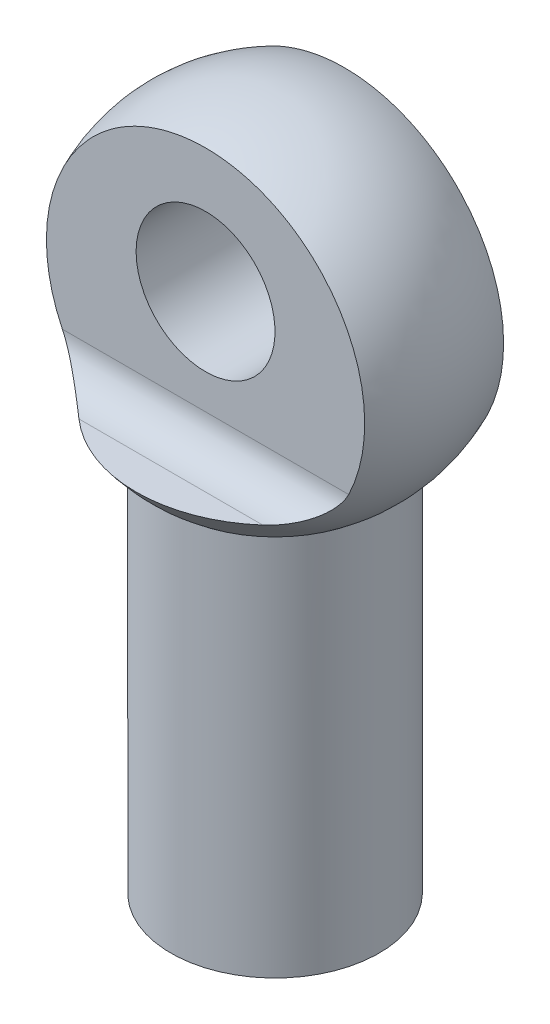
ISO-10303-21;
HEADER;
FILE_DESCRIPTION(('STEP AP214'),'2;1');
FILE_NAME('part.step','',(''),(''),'','','');
FILE_SCHEMA(('AUTOMOTIVE_DESIGN { 1 0 10303 214 1 1 1 1 }'));
ENDSEC;
DATA;
#1=APPLICATION_CONTEXT('core data for automotive mechanical design processes');
#2=APPLICATION_PROTOCOL_DEFINITION('international standard','automotive_design',2000,#1);
#3=PRODUCT_CONTEXT('',#1,'mechanical');
#4=PRODUCT('Part','Part','',(#3));
#5=PRODUCT_RELATED_PRODUCT_CATEGORY('part','',(#4));
#6=PRODUCT_DEFINITION_FORMATION('','',#4);
#7=PRODUCT_DEFINITION_CONTEXT('part definition',#1,'design');
#8=PRODUCT_DEFINITION('design','',#6,#7);
#9=PRODUCT_DEFINITION_SHAPE('','',#8);
#10=(LENGTH_UNIT() NAMED_UNIT(*) SI_UNIT(.MILLI.,.METRE.));
#11=(NAMED_UNIT(*) PLANE_ANGLE_UNIT() SI_UNIT($,.RADIAN.));
#12=(NAMED_UNIT(*) SI_UNIT($,.STERADIAN.) SOLID_ANGLE_UNIT());
#13=UNCERTAINTY_MEASURE_WITH_UNIT(LENGTH_MEASURE(1.E-05),#10,'distance_accuracy_value','');
#14=(GEOMETRIC_REPRESENTATION_CONTEXT(3) GLOBAL_UNCERTAINTY_ASSIGNED_CONTEXT((#13)) GLOBAL_UNIT_ASSIGNED_CONTEXT((#10,
#11,#12)) REPRESENTATION_CONTEXT('',''));
#15=CARTESIAN_POINT('',(0.,0.,0.));
#16=DIRECTION('',(0.,0.,1.));
#17=DIRECTION('',(1.,0.,0.));
#18=AXIS2_PLACEMENT_3D('',#15,#16,#17);
#19=CARTESIAN_POINT('',(0.,0.,0.));
#20=DIRECTION('',(0.,-1.,0.));
#21=DIRECTION('',(0.,0.,-1.));
#22=AXIS2_PLACEMENT_3D('',#19,#20,#21);
#23=CYLINDRICAL_SURFACE('',#22,3.);
#24=CARTESIAN_POINT('',(0.,0.,0.));
#25=DIRECTION('',(0.,-1.,0.));
#26=DIRECTION('',(0.,0.,-1.));
#27=AXIS2_PLACEMENT_3D('',#24,#25,#26);
#28=CIRCLE('',#27,3.);
#29=CARTESIAN_POINT('',(0.,0.,-3.));
#30=VERTEX_POINT('',#29);
#31=EDGE_CURVE('E141',#30,#30,#28,.T.);
#32=ORIENTED_EDGE('',*,*,#31,.F.);
#33=EDGE_LOOP('',(#32));
#34=FACE_BOUND('',#33,.T.);
#35=CARTESIAN_POINT('',(0.,11.,0.));
#36=DIRECTION('',(0.,-1.,0.));
#37=DIRECTION('',(0.,0.,-1.));
#38=AXIS2_PLACEMENT_3D('',#35,#36,#37);
#39=CIRCLE('',#38,3.);
#40=CARTESIAN_POINT('',(0.,11.,-3.));
#41=VERTEX_POINT('',#40);
#42=EDGE_CURVE('E143',#41,#41,#39,.T.);
#43=ORIENTED_EDGE('',*,*,#42,.T.);
#44=EDGE_LOOP('',(#43));
#45=FACE_BOUND('',#44,.T.);
#46=ADVANCED_FACE('F43',(#34,#45),#23,.T.);
#47=CARTESIAN_POINT('',(0.,0.,0.));
#48=DIRECTION('',(0.,1.,0.));
#49=DIRECTION('',(0.,0.,1.));
#50=AXIS2_PLACEMENT_3D('',#47,#48,#49);
#51=PLANE('',#50);
#52=ORIENTED_EDGE('',*,*,#31,.T.);
#53=EDGE_LOOP('',(#52));
#54=FACE_BOUND('',#53,.T.);
#55=ADVANCED_FACE('F130',(#54),#51,.F.);
#56=CARTESIAN_POINT('',(0.,15.,0.));
#57=DIRECTION('',(0.,-1.,0.));
#58=DIRECTION('',(0.,0.,1.));
#59=AXIS2_PLACEMENT_3D('',#56,#57,#58);
#60=SPHERICAL_SURFACE('',#59,5.);
#61=CARTESIAN_POINT('',(0.,15.,2.));
#62=DIRECTION('',(0.,0.,-1.));
#63=DIRECTION('',(-1.,0.,0.));
#64=AXIS2_PLACEMENT_3D('',#61,#62,#63);
#65=CIRCLE('',#64,4.58257569495584);
#66=CARTESIAN_POINT('',(-4.12310562561766,13.,2.));
#67=VERTEX_POINT('',#66);
#68=CARTESIAN_POINT('',(4.12310562561766,13.,2.));
#69=VERTEX_POINT('',#68);
#70=EDGE_CURVE('E88',#67,#69,#65,.T.);
#71=ORIENTED_EDGE('',*,*,#70,.T.);
#72=CARTESIAN_POINT('',(4.12310562561766,13.,2.));
#73=CARTESIAN_POINT('',(4.0931318605075,12.9382207465853,2.00002949748679));
#74=CARTESIAN_POINT('',(4.05971073396143,12.8785415895747,2.00570946208169));
#75=CARTESIAN_POINT('',(3.9877832975061,12.7648122807007,2.0263465034949));
#76=CARTESIAN_POINT('',(3.94932922525889,12.7107133247071,2.04121343980338));
#77=CARTESIAN_POINT('',(3.85741734017865,12.5942966682346,2.08336267656611));
#78=CARTESIAN_POINT('',(3.80273853331144,12.5337993232022,2.11293277323871));
#79=CARTESIAN_POINT('',(3.68881786037103,12.4225086423669,2.18098778358637));
#80=CARTESIAN_POINT('',(3.62955528917085,12.3717634382405,2.21951494014308));
#81=CARTESIAN_POINT('',(3.48826824495654,12.2653266865496,2.31662586486972));
#82=CARTESIAN_POINT('',(3.40510632099553,12.2133885323858,2.37765842430899));
#83=CARTESIAN_POINT('',(3.2358451895882,12.1264535216578,2.50704986537997));
#84=CARTESIAN_POINT('',(3.14974507185081,12.0914619673289,2.5754110318186));
#85=CARTESIAN_POINT('',(2.99349930364045,12.043261259101,2.70280786997431));
#86=CARTESIAN_POINT('',(2.92356711904682,12.0271123196379,2.76101291170021));
#87=CARTESIAN_POINT('',(2.81893550239108,12.0108996349424,2.84973566460491));
#88=CARTESIAN_POINT('',(2.7841707058168,12.0068307132997,2.87948601829577));
#89=CARTESIAN_POINT('',(2.71480540680139,12.0013840998272,2.93942900045119));
#90=CARTESIAN_POINT('',(2.68020492424758,12.0000067258776,2.96962168073173));
#91=CARTESIAN_POINT('',(2.64575131106459,12.,3.));
#92=B_SPLINE_CURVE_WITH_KNOTS('',3,(#72,#73,#74,#75,#76,#77,#78,#79,#80,#81,#82,#83,#84,#85,#86,
#87,#88,#89,#90,#91),.UNSPECIFIED.,.F.,.F.,(4,2,2,2,2,2,2,2,2,4),(0.,0.205092579444076,
0.408204104918546,0.667070036761067,0.927182515977705,1.27184076098277,1.61660677276189,
1.89316652724031,2.03090682988791,2.16866339911652),.UNSPECIFIED.);
#93=CARTESIAN_POINT('',(2.64575131106459,12.,3.));
#94=VERTEX_POINT('',#93);
#95=EDGE_CURVE('E94',#69,#94,#92,.T.);
#96=ORIENTED_EDGE('',*,*,#95,.T.);
#97=CARTESIAN_POINT('',(0.,12.,0.));
#98=DIRECTION('',(0.,-1.,0.));
#99=DIRECTION('',(0.,0.,-1.));
#100=AXIS2_PLACEMENT_3D('',#97,#98,#99);
#101=CIRCLE('',#100,4.);
#102=CARTESIAN_POINT('',(-2.64575131106459,12.,3.));
#103=VERTEX_POINT('',#102);
#104=EDGE_CURVE('E90',#94,#103,#101,.T.);
#105=ORIENTED_EDGE('',*,*,#104,.T.);
#106=CARTESIAN_POINT('',(-2.64575131106459,12.,3.));
#107=CARTESIAN_POINT('',(-2.69458242415424,12.0000238389908,2.95696353764354));
#108=CARTESIAN_POINT('',(-2.74370550671373,12.0027789999016,2.91427341673294));
#109=CARTESIAN_POINT('',(-2.84220545277897,12.0136606597689,2.82981958380546));
#110=CARTESIAN_POINT('',(-2.89158245101973,12.0217903846908,2.78805644375903));
#111=CARTESIAN_POINT('',(-2.99053024429044,12.0434016251835,2.70546743096911));
#112=CARTESIAN_POINT('',(-3.04010012746959,12.0569185627351,2.6646496926651));
#113=CARTESIAN_POINT('',(-3.13876292442797,12.0893172331001,2.58464512082968));
#114=CARTESIAN_POINT('',(-3.18785598452982,12.1081972626543,2.54545777402659));
#115=CARTESIAN_POINT('',(-3.31481070913178,12.1644954901456,2.44601949470996));
#116=CARTESIAN_POINT('',(-3.39209184791986,12.2062164301118,2.38738261465338));
#117=CARTESIAN_POINT('',(-3.54302200764926,12.3040759554687,2.2781619656057));
#118=CARTESIAN_POINT('',(-3.61667840049503,12.3601837033625,2.22756134233096));
#119=CARTESIAN_POINT('',(-3.73928754899963,12.4700250929265,2.15008757295993));
#120=CARTESIAN_POINT('',(-3.78956497050251,12.5203546033238,2.12049109623891));
#121=CARTESIAN_POINT('',(-3.88574802317231,12.6286033890641,2.06961178003133));
#122=CARTESIAN_POINT('',(-3.93166920177133,12.6864937735804,2.04829846360513));
#123=CARTESIAN_POINT('',(-4.00214453296941,12.7871916154429,2.02206121396138));
#124=CARTESIAN_POINT('',(-4.02845244345467,12.8279559840822,2.01400050166362));
#125=CARTESIAN_POINT('',(-4.07816013871327,12.9121308756713,2.00296011607275));
#126=CARTESIAN_POINT('',(-4.10154509143043,12.9555533509454,2.0000054528643));
#127=CARTESIAN_POINT('',(-4.12310562561766,13.,2.));
#128=B_SPLINE_CURVE_WITH_KNOTS('',3,(#106,#107,#108,#109,#110,#111,#112,#113,#114,#115,#116,
#117,#118,#119,#120,#121,#122,#123,#124,#125,#126,#127),.UNSPECIFIED.,.F.,.F.,(4,2,2,2,2,2,2,2,
2,2,4),(0.,0.195195044136388,0.390507356369891,0.587125650709546,0.783681570916077,
1.0992579605892,1.41416349952215,1.64455497496108,1.87409053909587,2.02124980792783,
2.16912786007797),.UNSPECIFIED.);
#129=EDGE_CURVE('E85',#103,#67,#128,.T.);
#130=ORIENTED_EDGE('',*,*,#129,.T.);
#131=EDGE_LOOP('',(#71,#96,#105,#130));
#132=FACE_BOUND('',#131,.T.);
#133=CARTESIAN_POINT('',(0.,12.,0.));
#134=DIRECTION('',(0.,-1.,0.));
#135=DIRECTION('',(0.,0.,-1.));
#136=AXIS2_PLACEMENT_3D('',#133,#134,#135);
#137=CIRCLE('',#136,4.);
#138=CARTESIAN_POINT('',(-2.64575131106459,12.,-3.));
#139=VERTEX_POINT('',#138);
#140=CARTESIAN_POINT('',(2.64575131106459,12.,-3.));
#141=VERTEX_POINT('',#140);
#142=EDGE_CURVE('E145',#139,#141,#137,.T.);
#143=ORIENTED_EDGE('',*,*,#142,.T.);
#144=CARTESIAN_POINT('',(2.64575131106459,12.,-3.));
#145=CARTESIAN_POINT('',(2.69458242415424,12.0000238389908,-2.95696353764354));
#146=CARTESIAN_POINT('',(2.74370550671373,12.0027789999016,-2.91427341673294));
#147=CARTESIAN_POINT('',(2.84220545277897,12.0136606597689,-2.82981958380546));
#148=CARTESIAN_POINT('',(2.89158245101973,12.0217903846908,-2.78805644375903));
#149=CARTESIAN_POINT('',(2.99053024429044,12.0434016251835,-2.70546743096911));
#150=CARTESIAN_POINT('',(3.04010012746959,12.0569185627351,-2.6646496926651));
#151=CARTESIAN_POINT('',(3.13876292442797,12.0893172331001,-2.58464512082968));
#152=CARTESIAN_POINT('',(3.18785598452982,12.1081972626543,-2.54545777402659));
#153=CARTESIAN_POINT('',(3.31481070913177,12.1644954901456,-2.44601949470996));
#154=CARTESIAN_POINT('',(3.39209184791986,12.2062164301118,-2.38738261465338));
#155=CARTESIAN_POINT('',(3.54302200764926,12.3040759554687,-2.2781619656057));
#156=CARTESIAN_POINT('',(3.61667840049503,12.3601837033625,-2.22756134233096));
#157=CARTESIAN_POINT('',(3.73928754899963,12.4700250929265,-2.15008757295993));
#158=CARTESIAN_POINT('',(3.78956497050251,12.5203546033238,-2.12049109623891));
#159=CARTESIAN_POINT('',(3.88574802317231,12.6286033890641,-2.06961178003133));
#160=CARTESIAN_POINT('',(3.93166920177132,12.6864937735804,-2.04829846360513));
#161=CARTESIAN_POINT('',(4.00214453296941,12.7871916154429,-2.02206121396138));
#162=CARTESIAN_POINT('',(4.02845244345467,12.8279559840822,-2.01400050166362));
#163=CARTESIAN_POINT('',(4.07816013871327,12.9121308756713,-2.00296011607275));
#164=CARTESIAN_POINT('',(4.10154509143043,12.9555533509454,-2.0000054528643));
#165=CARTESIAN_POINT('',(4.12310562561766,13.,-2.));
#166=B_SPLINE_CURVE_WITH_KNOTS('',3,(#144,#145,#146,#147,#148,#149,#150,#151,#152,#153,#154,
#155,#156,#157,#158,#159,#160,#161,#162,#163,#164,#165),.UNSPECIFIED.,.F.,.F.,(4,2,2,2,2,2,2,2,
2,2,4),(0.,0.195195044136387,0.390507356369889,0.587125650709544,0.783681570916075,
1.0992579605892,1.41416349952215,1.64455497496108,1.87409053909587,2.02124980792783,
2.16912786007797),.UNSPECIFIED.);
#167=CARTESIAN_POINT('',(4.12310562561766,13.,-2.));
#168=VERTEX_POINT('',#167);
#169=EDGE_CURVE('E53',#141,#168,#166,.T.);
#170=ORIENTED_EDGE('',*,*,#169,.T.);
#171=CARTESIAN_POINT('',(0.,15.,-2.));
#172=DIRECTION('',(0.,0.,1.));
#173=DIRECTION('',(1.,0.,0.));
#174=AXIS2_PLACEMENT_3D('',#171,#172,#173);
#175=CIRCLE('',#174,4.58257569495584);
#176=CARTESIAN_POINT('',(-4.12310562561766,13.,-2.));
#177=VERTEX_POINT('',#176);
#178=EDGE_CURVE('E142',#168,#177,#175,.T.);
#179=ORIENTED_EDGE('',*,*,#178,.T.);
#180=CARTESIAN_POINT('',(-4.12310562561766,13.,-2.));
#181=CARTESIAN_POINT('',(-4.0931318605075,12.9382207465853,-2.00002949748679));
#182=CARTESIAN_POINT('',(-4.05971073396143,12.8785415895747,-2.00570946208169));
#183=CARTESIAN_POINT('',(-3.9877832975061,12.7648122807007,-2.0263465034949));
#184=CARTESIAN_POINT('',(-3.94932922525889,12.7107133247071,-2.04121343980338));
#185=CARTESIAN_POINT('',(-3.85741734017865,12.5942966682346,-2.08336267656611));
#186=CARTESIAN_POINT('',(-3.80273853331144,12.5337993232022,-2.11293277323871));
#187=CARTESIAN_POINT('',(-3.68881786037103,12.4225086423669,-2.18098778358637));
#188=CARTESIAN_POINT('',(-3.62955528917085,12.3717634382405,-2.21951494014308));
#189=CARTESIAN_POINT('',(-3.48826824495654,12.2653266865496,-2.31662586486972));
#190=CARTESIAN_POINT('',(-3.40510632099553,12.2133885323858,-2.37765842430899));
#191=CARTESIAN_POINT('',(-3.2358451895882,12.1264535216578,-2.50704986537997));
#192=CARTESIAN_POINT('',(-3.14974507185081,12.0914619673289,-2.5754110318186));
#193=CARTESIAN_POINT('',(-2.99349930364045,12.043261259101,-2.70280786997431));
#194=CARTESIAN_POINT('',(-2.92356711904682,12.0271123196379,-2.76101291170021));
#195=CARTESIAN_POINT('',(-2.81893550239108,12.0108996349424,-2.84973566460491));
#196=CARTESIAN_POINT('',(-2.7841707058168,12.0068307132997,-2.87948601829577));
#197=CARTESIAN_POINT('',(-2.71480540680139,12.0013840998272,-2.93942900045119));
#198=CARTESIAN_POINT('',(-2.68020492424758,12.0000067258776,-2.96962168073173));
#199=CARTESIAN_POINT('',(-2.64575131106459,12.,-3.));
#200=B_SPLINE_CURVE_WITH_KNOTS('',3,(#180,#181,#182,#183,#184,#185,#186,#187,#188,#189,#190,
#191,#192,#193,#194,#195,#196,#197,#198,#199),.UNSPECIFIED.,.F.,.F.,(4,2,2,2,2,2,2,2,2,4),(0.,
0.205092579444076,0.408204104918546,0.667070036761067,0.927182515977705,1.27184076098277,
1.61660677276189,1.89316652724031,2.03090682988791,2.16866339911652),.UNSPECIFIED.);
#201=EDGE_CURVE('E11',#177,#139,#200,.T.);
#202=ORIENTED_EDGE('',*,*,#201,.T.);
#203=EDGE_LOOP('',(#143,#170,#179,#202));
#204=FACE_BOUND('',#203,.T.);
#205=ORIENTED_EDGE('',*,*,#42,.F.);
#206=EDGE_LOOP('',(#205));
#207=FACE_BOUND('',#206,.T.);
#208=ADVANCED_FACE('F87',(#132,#204,#207),#60,.T.);
#209=CARTESIAN_POINT('',(-7.5,12.,-2.));
#210=DIRECTION('',(0.,-1.,0.));
#211=DIRECTION('',(0.,0.,-1.));
#212=AXIS2_PLACEMENT_3D('',#209,#210,#211);
#213=PLANE('',#212);
#214=ORIENTED_EDGE('',*,*,#142,.F.);
#215=DIRECTION('',(1.,0.,0.));
#216=VECTOR('',#215,1.);
#217=CARTESIAN_POINT('',(3.46410161513776,12.,-3.));
#218=LINE('',#217,#216);
#219=EDGE_CURVE('E104',#139,#141,#218,.T.);
#220=ORIENTED_EDGE('',*,*,#219,.T.);
#221=EDGE_LOOP('',(#214,#220));
#222=FACE_BOUND('',#221,.T.);
#223=ADVANCED_FACE('F138',(#222),#213,.F.);
#224=CARTESIAN_POINT('',(-7.5,12.,-2.));
#225=DIRECTION('',(0.,0.,1.));
#226=DIRECTION('',(1.,0.,0.));
#227=AXIS2_PLACEMENT_3D('',#224,#225,#226);
#228=PLANE('',#227);
#229=CARTESIAN_POINT('',(0.,16.,-2.));
#230=DIRECTION('',(0.,0.,1.));
#231=DIRECTION('',(1.,0.,0.));
#232=AXIS2_PLACEMENT_3D('',#229,#230,#231);
#233=CIRCLE('',#232,2.);
#234=CARTESIAN_POINT('',(2.,16.,-2.));
#235=VERTEX_POINT('',#234);
#236=EDGE_CURVE('E148',#235,#235,#233,.T.);
#237=ORIENTED_EDGE('',*,*,#236,.T.);
#238=EDGE_LOOP('',(#237));
#239=FACE_BOUND('',#238,.T.);
#240=ORIENTED_EDGE('',*,*,#178,.F.);
#241=DIRECTION('',(1.,0.,0.));
#242=VECTOR('',#241,1.);
#243=CARTESIAN_POINT('',(-3.46410161513776,13.,-2.));
#244=LINE('',#243,#242);
#245=EDGE_CURVE('E59',#168,#177,#244,.F.);
#246=ORIENTED_EDGE('',*,*,#245,.T.);
#247=EDGE_LOOP('',(#240,#246));
#248=FACE_BOUND('',#247,.T.);
#249=ADVANCED_FACE('F184',(#239,#248),#228,.F.);
#250=CARTESIAN_POINT('',(-7.5,12.,2.));
#251=DIRECTION('',(0.,0.,-1.));
#252=DIRECTION('',(-1.,0.,0.));
#253=AXIS2_PLACEMENT_3D('',#250,#251,#252);
#254=PLANE('',#253);
#255=CARTESIAN_POINT('',(0.,16.,2.));
#256=DIRECTION('',(0.,0.,-1.));
#257=DIRECTION('',(-1.,0.,0.));
#258=AXIS2_PLACEMENT_3D('',#255,#256,#257);
#259=CIRCLE('',#258,2.);
#260=CARTESIAN_POINT('',(-2.,16.,2.));
#261=VERTEX_POINT('',#260);
#262=EDGE_CURVE('E48',#261,#261,#259,.T.);
#263=ORIENTED_EDGE('',*,*,#262,.T.);
#264=EDGE_LOOP('',(#263));
#265=FACE_BOUND('',#264,.T.);
#266=ORIENTED_EDGE('',*,*,#70,.F.);
#267=DIRECTION('',(1.,0.,0.));
#268=VECTOR('',#267,1.);
#269=CARTESIAN_POINT('',(3.46410161513776,13.,2.));
#270=LINE('',#269,#268);
#271=EDGE_CURVE('E99',#67,#69,#270,.T.);
#272=ORIENTED_EDGE('',*,*,#271,.T.);
#273=EDGE_LOOP('',(#266,#272));
#274=FACE_BOUND('',#273,.T.);
#275=ADVANCED_FACE('F98',(#265,#274),#254,.F.);
#276=CARTESIAN_POINT('',(-7.5,12.,2.));
#277=DIRECTION('',(0.,-1.,0.));
#278=DIRECTION('',(0.,0.,-1.));
#279=AXIS2_PLACEMENT_3D('',#276,#277,#278);
#280=PLANE('',#279);
#281=ORIENTED_EDGE('',*,*,#104,.F.);
#282=DIRECTION('',(1.,0.,0.));
#283=VECTOR('',#282,1.);
#284=CARTESIAN_POINT('',(-3.46410161513776,12.,3.));
#285=LINE('',#284,#283);
#286=EDGE_CURVE('E102',#94,#103,#285,.F.);
#287=ORIENTED_EDGE('',*,*,#286,.T.);
#288=EDGE_LOOP('',(#281,#287));
#289=FACE_BOUND('',#288,.T.);
#290=ADVANCED_FACE('F127',(#289),#280,.F.);
#291=CARTESIAN_POINT('',(-7.5,13.,3.));
#292=DIRECTION('',(-1.,0.,0.));
#293=DIRECTION('',(0.,0.,1.));
#294=AXIS2_PLACEMENT_3D('',#291,#292,#293);
#295=CYLINDRICAL_SURFACE('',#294,1.);
#296=ORIENTED_EDGE('',*,*,#129,.F.);
#297=ORIENTED_EDGE('',*,*,#286,.F.);
#298=ORIENTED_EDGE('',*,*,#95,.F.);
#299=ORIENTED_EDGE('',*,*,#271,.F.);
#300=EDGE_LOOP('',(#296,#297,#298,#299));
#301=FACE_BOUND('',#300,.T.);
#302=ADVANCED_FACE('F101',(#301),#295,.F.);
#303=CARTESIAN_POINT('',(-7.5,13.,-3.));
#304=DIRECTION('',(-1.,0.,0.));
#305=DIRECTION('',(0.,0.,1.));
#306=AXIS2_PLACEMENT_3D('',#303,#304,#305);
#307=CYLINDRICAL_SURFACE('',#306,1.);
#308=ORIENTED_EDGE('',*,*,#201,.F.);
#309=ORIENTED_EDGE('',*,*,#245,.F.);
#310=ORIENTED_EDGE('',*,*,#169,.F.);
#311=ORIENTED_EDGE('',*,*,#219,.F.);
#312=EDGE_LOOP('',(#308,#309,#310,#311));
#313=FACE_BOUND('',#312,.T.);
#314=ADVANCED_FACE('F45',(#313),#307,.F.);
#315=CARTESIAN_POINT('',(0.,16.,7.5));
#316=DIRECTION('',(0.,0.,-1.));
#317=DIRECTION('',(-1.,0.,0.));
#318=AXIS2_PLACEMENT_3D('',#315,#316,#317);
#319=CYLINDRICAL_SURFACE('',#318,2.);
#320=ORIENTED_EDGE('',*,*,#262,.F.);
#321=EDGE_LOOP('',(#320));
#322=FACE_BOUND('',#321,.T.);
#323=ORIENTED_EDGE('',*,*,#236,.F.);
#324=EDGE_LOOP('',(#323));
#325=FACE_BOUND('',#324,.T.);
#326=ADVANCED_FACE('F167',(#322,#325),#319,.F.);
#327=CLOSED_SHELL('',(#46,#55,#208,#223,#249,#275,#290,#302,#314,#326));
#328=MANIFOLD_SOLID_BREP('B2',#327);
#329=ADVANCED_BREP_SHAPE_REPRESENTATION('',(#18,#328),#14);
#330=SHAPE_DEFINITION_REPRESENTATION(#9,#329);
ENDSEC;
END-ISO-10303-21;
